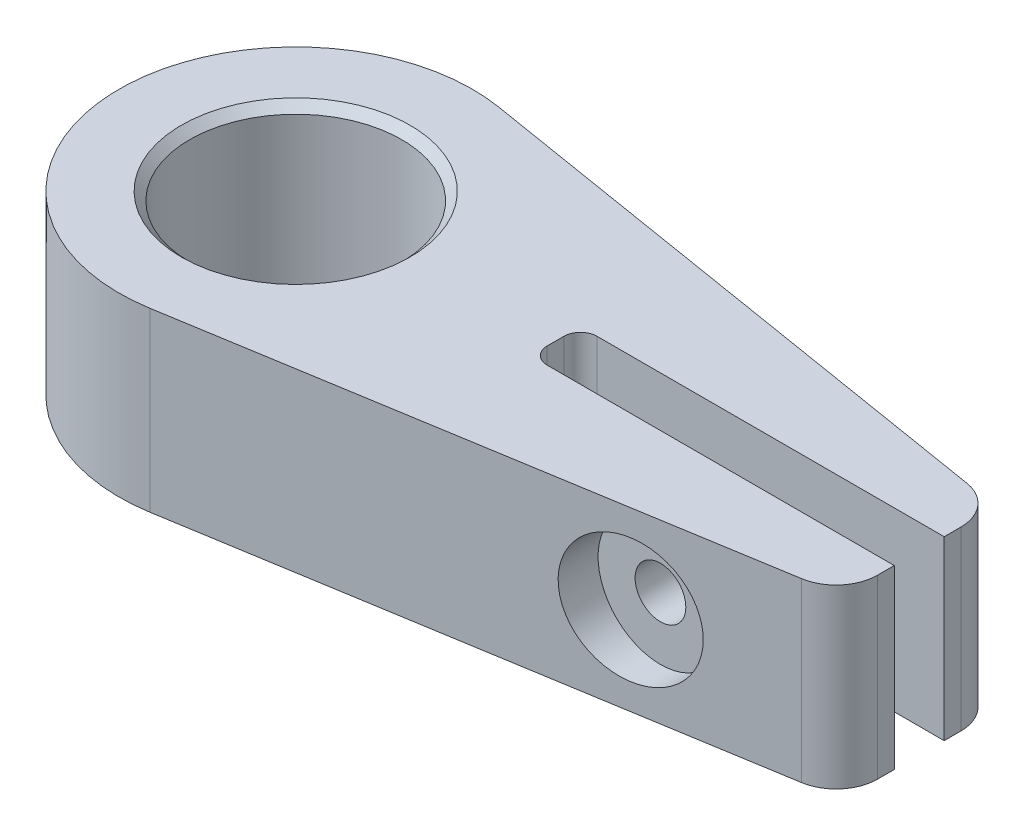
ISO-10303-21;
HEADER;
FILE_DESCRIPTION(('STEP AP214'),'2;1');
FILE_NAME('part.step','',(''),(''),'','','');
FILE_SCHEMA(('AUTOMOTIVE_DESIGN { 1 0 10303 214 1 1 1 1 }'));
ENDSEC;
DATA;
#1=APPLICATION_CONTEXT('core data for automotive mechanical design processes');
#2=APPLICATION_PROTOCOL_DEFINITION('international standard','automotive_design',2000,#1);
#3=PRODUCT_CONTEXT('',#1,'mechanical');
#4=PRODUCT('Part','Part','',(#3));
#5=PRODUCT_RELATED_PRODUCT_CATEGORY('part','',(#4));
#6=PRODUCT_DEFINITION_FORMATION('','',#4);
#7=PRODUCT_DEFINITION_CONTEXT('part definition',#1,'design');
#8=PRODUCT_DEFINITION('design','',#6,#7);
#9=PRODUCT_DEFINITION_SHAPE('','',#8);
#10=(LENGTH_UNIT() NAMED_UNIT(*) SI_UNIT(.MILLI.,.METRE.));
#11=(NAMED_UNIT(*) PLANE_ANGLE_UNIT() SI_UNIT($,.RADIAN.));
#12=(NAMED_UNIT(*) SI_UNIT($,.STERADIAN.) SOLID_ANGLE_UNIT());
#13=UNCERTAINTY_MEASURE_WITH_UNIT(LENGTH_MEASURE(1.E-05),#10,'distance_accuracy_value','');
#14=(GEOMETRIC_REPRESENTATION_CONTEXT(3) GLOBAL_UNCERTAINTY_ASSIGNED_CONTEXT((#13)) GLOBAL_UNIT_ASSIGNED_CONTEXT((#10,
#11,#12)) REPRESENTATION_CONTEXT('',''));
#15=CARTESIAN_POINT('',(0.,0.,0.));
#16=DIRECTION('',(0.,0.,1.));
#17=DIRECTION('',(1.,0.,0.));
#18=AXIS2_PLACEMENT_3D('',#15,#16,#17);
#19=CARTESIAN_POINT('',(1.74441855820216,10.795,-10.6531229643612));
#20=DIRECTION('',(-0.161595049393438,0.,0.986857152789365));
#21=DIRECTION('',(0.986857152789365,0.,0.161595049393438));
#22=AXIS2_PLACEMENT_3D('',#19,#20,#21);
#23=PLANE('',#22);
#24=DIRECTION('',(-0.986857152789365,0.,-0.161595049393438));
#25=VECTOR('',#24,1.);
#26=CARTESIAN_POINT('',(1.74441855820216,10.795,-10.6531229643612));
#27=LINE('',#26,#25);
#28=CARTESIAN_POINT('',(35.9704514254593,10.795,-5.04870751670183));
#29=VERTEX_POINT('',#28);
#30=CARTESIAN_POINT('',(1.74441855820216,10.795,-10.6531229643612));
#31=VERTEX_POINT('',#30);
#32=EDGE_CURVE('E222',#29,#31,#27,.T.);
#33=ORIENTED_EDGE('',*,*,#32,.F.);
#34=DIRECTION('',(0.,-1.,0.));
#35=VECTOR('',#34,1.);
#36=CARTESIAN_POINT('',(35.9704514254593,10.795,-5.04870751670183));
#37=LINE('',#36,#35);
#38=CARTESIAN_POINT('',(35.9704514254593,0.,-5.04870751670183));
#39=VERTEX_POINT('',#38);
#40=EDGE_CURVE('E286',#29,#39,#37,.T.);
#41=ORIENTED_EDGE('',*,*,#40,.T.);
#42=DIRECTION('',(-0.986857152789365,0.,-0.161595049393438));
#43=VECTOR('',#42,1.);
#44=CARTESIAN_POINT('',(1.74441855820216,0.,-10.6531229643612));
#45=LINE('',#44,#43);
#46=CARTESIAN_POINT('',(1.74441855820216,0.,-10.6531229643612));
#47=VERTEX_POINT('',#46);
#48=EDGE_CURVE('E204',#39,#47,#45,.T.);
#49=ORIENTED_EDGE('',*,*,#48,.T.);
#50=DIRECTION('',(0.,-1.,0.));
#51=VECTOR('',#50,1.);
#52=CARTESIAN_POINT('',(1.74441855820216,10.795,-10.6531229643612));
#53=LINE('',#52,#51);
#54=EDGE_CURVE('E217',#31,#47,#53,.T.);
#55=ORIENTED_EDGE('',*,*,#54,.F.);
#56=EDGE_LOOP('',(#33,#41,#49,#55));
#57=FACE_BOUND('',#56,.T.);
#58=DIRECTION('',(-0.857446756121753,0.495047115462666,-0.140404465343438));
#59=VECTOR('',#58,1.);
#60=CARTESIAN_POINT('',(4.23908548831598,15.2317464535393,-10.2446283563498));
#61=LINE('',#60,#59);
#62=CARTESIAN_POINT('',(26.9875,2.09794321158129,-6.51964024003772));
#63=VERTEX_POINT('',#62);
#64=CARTESIAN_POINT('',(24.13,3.74772160579065,-6.98754773033313));
#65=VERTEX_POINT('',#64);
#66=EDGE_CURVE('E257',#63,#65,#61,.T.);
#67=ORIENTED_EDGE('',*,*,#66,.F.);
#68=DIRECTION('',(-0.857446756121753,-0.495047115462666,-0.140404465343438));
#69=VECTOR('',#68,1.);
#70=CARTESIAN_POINT('',(11.6224786928472,-6.77305597620772,-9.03561873808336));
#71=LINE('',#70,#69);
#72=CARTESIAN_POINT('',(29.845,3.74772160579065,-6.0517327497423));
#73=VERTEX_POINT('',#72);
#74=EDGE_CURVE('E226',#73,#63,#71,.T.);
#75=ORIENTED_EDGE('',*,*,#74,.F.);
#76=DIRECTION('',(0.,-1.,0.));
#77=VECTOR('',#76,1.);
#78=CARTESIAN_POINT('',(29.845,10.795,-6.0517327497423));
#79=LINE('',#78,#77);
#80=CARTESIAN_POINT('',(29.845,7.04727839420936,-6.0517327497423));
#81=VERTEX_POINT('',#80);
#82=EDGE_CURVE('E244',#81,#73,#79,.T.);
#83=ORIENTED_EDGE('',*,*,#82,.F.);
#84=DIRECTION('',(0.857446756121753,-0.495047115462666,0.140404465343438));
#85=VECTOR('',#84,1.);
#86=CARTESIAN_POINT('',(7.04025440812994,20.2136044004765,-9.78594492007207));
#87=LINE('',#86,#85);
#88=CARTESIAN_POINT('',(26.9875,8.69705678841871,-6.51964024003772));
#89=VERTEX_POINT('',#88);
#90=EDGE_CURVE('E248',#89,#81,#87,.T.);
#91=ORIENTED_EDGE('',*,*,#90,.F.);
#92=DIRECTION('',(0.857446756121753,0.495047115462666,0.140404465343438));
#93=VECTOR('',#92,1.);
#94=CARTESIAN_POINT('',(8.82130977303323,-1.79119802927051,-9.49430217436111));
#95=LINE('',#94,#93);
#96=CARTESIAN_POINT('',(24.13,7.04727839420935,-6.98754773033313));
#97=VERTEX_POINT('',#96);
#98=EDGE_CURVE('E251',#97,#89,#95,.T.);
#99=ORIENTED_EDGE('',*,*,#98,.F.);
#100=DIRECTION('',(0.,1.,0.));
#101=VECTOR('',#100,1.);
#102=CARTESIAN_POINT('',(24.13,10.795,-6.98754773033313));
#103=LINE('',#102,#101);
#104=EDGE_CURVE('E254',#65,#97,#103,.T.);
#105=ORIENTED_EDGE('',*,*,#104,.F.);
#106=EDGE_LOOP('',(#67,#75,#83,#91,#99,#105));
#107=FACE_BOUND('',#106,.T.);
#108=ADVANCED_FACE('F47',(#57,#107),#23,.F.);
#109=CARTESIAN_POINT('',(26.9875,5.3975,-10.795));
#110=DIRECTION('',(0.,0.,1.));
#111=DIRECTION('',(1.,0.,0.));
#112=AXIS2_PLACEMENT_3D('',#109,#110,#111);
#113=CYLINDRICAL_SURFACE('',#112,1.55);
#114=CARTESIAN_POINT('',(26.9875,5.3975,-1.525));
#115=DIRECTION('',(0.,0.,-1.));
#116=DIRECTION('',(-1.,0.,0.));
#117=AXIS2_PLACEMENT_3D('',#114,#115,#116);
#118=CIRCLE('',#117,1.55);
#119=CARTESIAN_POINT('',(28.5375,5.3975,-1.525));
#120=VERTEX_POINT('',#119);
#121=EDGE_CURVE('E236',#120,#120,#118,.T.);
#122=CARTESIAN_POINT('',(26.9875,5.3975,-4.7));
#123=DIRECTION('',(0.,0.,-1.));
#124=DIRECTION('',(-1.,0.,0.));
#125=AXIS2_PLACEMENT_3D('',#122,#123,#124);
#126=CIRCLE('',#125,1.55);
#127=CARTESIAN_POINT('',(28.5375,5.3975,-4.7));
#128=VERTEX_POINT('',#127);
#129=EDGE_CURVE('E237',#128,#128,#126,.F.);
#130=CARTESIAN_POINT('',(28.5375,5.3975,-1.525));
#131=CARTESIAN_POINT('',(28.5375,5.3975,-1.55807291666667));
#132=CARTESIAN_POINT('',(28.5375,5.3975,-1.59114583333333));
#133=CARTESIAN_POINT('',(28.5375,5.3975,-1.65729166666667));
#134=CARTESIAN_POINT('',(28.5375,5.3975,-1.69036458333333));
#135=CARTESIAN_POINT('',(28.5375,5.3975,-1.75651041666667));
#136=CARTESIAN_POINT('',(28.5375,5.3975,-1.78958333333333));
#137=CARTESIAN_POINT('',(28.5375,5.3975,-1.85572916666667));
#138=CARTESIAN_POINT('',(28.5375,5.3975,-1.88880208333333));
#139=CARTESIAN_POINT('',(28.5375,5.3975,-1.95494791666666));
#140=CARTESIAN_POINT('',(28.5375,5.3975,-1.98802083333333));
#141=CARTESIAN_POINT('',(28.5375,5.3975,-2.05416666666666));
#142=CARTESIAN_POINT('',(28.5375,5.3975,-2.08723958333333));
#143=CARTESIAN_POINT('',(28.5375,5.3975,-2.15338541666667));
#144=CARTESIAN_POINT('',(28.5375,5.3975,-2.18645833333333));
#145=CARTESIAN_POINT('',(28.5375,5.3975,-2.25260416666666));
#146=CARTESIAN_POINT('',(28.5375,5.3975,-2.28567708333333));
#147=CARTESIAN_POINT('',(28.5375,5.3975,-2.35182291666666));
#148=CARTESIAN_POINT('',(28.5375,5.3975,-2.38489583333333));
#149=CARTESIAN_POINT('',(28.5375,5.3975,-2.45104166666667));
#150=CARTESIAN_POINT('',(28.5375,5.3975,-2.48411458333333));
#151=CARTESIAN_POINT('',(28.5375,5.3975,-2.55026041666666));
#152=CARTESIAN_POINT('',(28.5375,5.3975,-2.58333333333333));
#153=CARTESIAN_POINT('',(28.5375,5.3975,-2.64947916666666));
#154=CARTESIAN_POINT('',(28.5375,5.3975,-2.68255208333333));
#155=CARTESIAN_POINT('',(28.5375,5.3975,-2.74869791666666));
#156=CARTESIAN_POINT('',(28.5375,5.3975,-2.78177083333333));
#157=CARTESIAN_POINT('',(28.5375,5.3975,-2.84791666666667));
#158=CARTESIAN_POINT('',(28.5375,5.3975,-2.88098958333333));
#159=CARTESIAN_POINT('',(28.5375,5.3975,-2.94713541666666));
#160=CARTESIAN_POINT('',(28.5375,5.3975,-2.98020833333333));
#161=CARTESIAN_POINT('',(28.5375,5.3975,-3.04635416666666));
#162=CARTESIAN_POINT('',(28.5375,5.3975,-3.07942708333333));
#163=CARTESIAN_POINT('',(28.5375,5.3975,-3.14557291666666));
#164=CARTESIAN_POINT('',(28.5375,5.3975,-3.17864583333333));
#165=CARTESIAN_POINT('',(28.5375,5.3975,-3.24479166666666));
#166=CARTESIAN_POINT('',(28.5375,5.3975,-3.27786458333333));
#167=CARTESIAN_POINT('',(28.5375,5.3975,-3.34401041666666));
#168=CARTESIAN_POINT('',(28.5375,5.3975,-3.37708333333333));
#169=CARTESIAN_POINT('',(28.5375,5.3975,-3.44322916666666));
#170=CARTESIAN_POINT('',(28.5375,5.3975,-3.47630208333333));
#171=CARTESIAN_POINT('',(28.5375,5.3975,-3.54244791666666));
#172=CARTESIAN_POINT('',(28.5375,5.3975,-3.57552083333333));
#173=CARTESIAN_POINT('',(28.5375,5.3975,-3.64166666666666));
#174=CARTESIAN_POINT('',(28.5375,5.3975,-3.67473958333333));
#175=CARTESIAN_POINT('',(28.5375,5.3975,-3.74088541666666));
#176=CARTESIAN_POINT('',(28.5375,5.3975,-3.77395833333333));
#177=CARTESIAN_POINT('',(28.5375,5.3975,-3.84010416666666));
#178=CARTESIAN_POINT('',(28.5375,5.3975,-3.87317708333333));
#179=CARTESIAN_POINT('',(28.5375,5.3975,-3.93932291666666));
#180=CARTESIAN_POINT('',(28.5375,5.3975,-3.97239583333333));
#181=CARTESIAN_POINT('',(28.5375,5.3975,-4.03854166666666));
#182=CARTESIAN_POINT('',(28.5375,5.3975,-4.07161458333333));
#183=CARTESIAN_POINT('',(28.5375,5.3975,-4.13776041666666));
#184=CARTESIAN_POINT('',(28.5375,5.3975,-4.17083333333333));
#185=CARTESIAN_POINT('',(28.5375,5.3975,-4.23697916666666));
#186=CARTESIAN_POINT('',(28.5375,5.3975,-4.27005208333333));
#187=CARTESIAN_POINT('',(28.5375,5.3975,-4.33619791666666));
#188=CARTESIAN_POINT('',(28.5375,5.3975,-4.36927083333333));
#189=CARTESIAN_POINT('',(28.5375,5.3975,-4.43541666666666));
#190=CARTESIAN_POINT('',(28.5375,5.3975,-4.46848958333333));
#191=CARTESIAN_POINT('',(28.5375,5.3975,-4.53463541666666));
#192=CARTESIAN_POINT('',(28.5375,5.3975,-4.56770833333333));
#193=CARTESIAN_POINT('',(28.5375,5.3975,-4.63385416666666));
#194=CARTESIAN_POINT('',(28.5375,5.3975,-4.66692708333333));
#195=CARTESIAN_POINT('',(28.5375,5.3975,-4.7));
#196=B_SPLINE_CURVE_WITH_KNOTS('',3,(#130,#131,#132,#133,#134,#135,#136,#137,#138,#139,#140,
#141,#142,#143,#144,#145,#146,#147,#148,#149,#150,#151,#152,#153,#154,#155,#156,#157,#158,#159,
#160,#161,#162,#163,#164,#165,#166,#167,#168,#169,#170,#171,#172,#173,#174,#175,#176,#177,#178,
#179,#180,#181,#182,#183,#184,#185,#186,#187,#188,#189,#190,#191,#192,#193,#194,#195),
.UNSPECIFIED.,.F.,.F.,(4,2,2,2,2,2,2,2,2,2,2,2,2,2,2,2,2,2,2,2,2,2,2,2,2,2,2,2,2,2,2,2,4),(0.,
0.0992187499999995,0.198437500000001,0.29765625,0.396875,0.496093749999999,0.5953125,0.69453125,
0.793749999999999,0.892968750000001,0.9921875,1.09140625,1.190625,1.28984375,1.3890625,
1.48828125,1.5875,1.68671875,1.7859375,1.88515625,1.984375,2.08359375,2.1828125,2.28203125,
2.38125,2.48046875,2.5796875,2.67890625,2.778125,2.87734375,2.9765625,3.07578125,3.175),.UNSPECIFIED.);
#197=EDGE_CURVE('BSEAM354',#120,#128,#196,.T.);
#198=ORIENTED_EDGE('',*,*,#121,.F.);
#199=ORIENTED_EDGE('',*,*,#129,.F.);
#200=ORIENTED_EDGE('',*,*,#197,.T.);
#201=ORIENTED_EDGE('',*,*,#197,.F.);
#202=EDGE_LOOP('',(#198,#200,#199,#201));
#203=FACE_BOUND('',#202,.T.);
#204=ADVANCED_FACE('F354',(#203),#113,.F.);
#205=CARTESIAN_POINT('',(26.9875,5.3975,1.525));
#206=DIRECTION('',(0.,0.,1.));
#207=DIRECTION('',(1.,0.,0.));
#208=AXIS2_PLACEMENT_3D('',#205,#206,#207);
#209=CIRCLE('',#208,1.55);
#210=CARTESIAN_POINT('',(28.5375,5.3975,1.525));
#211=VERTEX_POINT('',#210);
#212=EDGE_CURVE('E458',#211,#211,#209,.T.);
#213=CARTESIAN_POINT('',(26.9875,5.3975,4.7));
#214=DIRECTION('',(0.,0.,1.));
#215=DIRECTION('',(1.,0.,0.));
#216=AXIS2_PLACEMENT_3D('',#213,#214,#215);
#217=CIRCLE('',#216,1.55);
#218=CARTESIAN_POINT('',(28.5375,5.3975,4.7));
#219=VERTEX_POINT('',#218);
#220=EDGE_CURVE('E227',#219,#219,#217,.F.);
#221=CARTESIAN_POINT('',(28.5375,5.3975,1.525));
#222=CARTESIAN_POINT('',(28.5375,5.3975,1.55807291666667));
#223=CARTESIAN_POINT('',(28.5375,5.3975,1.59114583333333));
#224=CARTESIAN_POINT('',(28.5375,5.3975,1.65729166666666));
#225=CARTESIAN_POINT('',(28.5375,5.3975,1.69036458333333));
#226=CARTESIAN_POINT('',(28.5375,5.3975,1.75651041666666));
#227=CARTESIAN_POINT('',(28.5375,5.3975,1.78958333333333));
#228=CARTESIAN_POINT('',(28.5375,5.3975,1.85572916666667));
#229=CARTESIAN_POINT('',(28.5375,5.3975,1.88880208333333));
#230=CARTESIAN_POINT('',(28.5375,5.3975,1.95494791666666));
#231=CARTESIAN_POINT('',(28.5375,5.3975,1.98802083333333));
#232=CARTESIAN_POINT('',(28.5375,5.3975,2.05416666666666));
#233=CARTESIAN_POINT('',(28.5375,5.3975,2.08723958333333));
#234=CARTESIAN_POINT('',(28.5375,5.3975,2.15338541666667));
#235=CARTESIAN_POINT('',(28.5375,5.3975,2.18645833333333));
#236=CARTESIAN_POINT('',(28.5375,5.3975,2.25260416666666));
#237=CARTESIAN_POINT('',(28.5375,5.3975,2.28567708333333));
#238=CARTESIAN_POINT('',(28.5375,5.3975,2.35182291666666));
#239=CARTESIAN_POINT('',(28.5375,5.3975,2.38489583333333));
#240=CARTESIAN_POINT('',(28.5375,5.3975,2.45104166666666));
#241=CARTESIAN_POINT('',(28.5375,5.3975,2.48411458333333));
#242=CARTESIAN_POINT('',(28.5375,5.3975,2.55026041666666));
#243=CARTESIAN_POINT('',(28.5375,5.3975,2.58333333333333));
#244=CARTESIAN_POINT('',(28.5375,5.3975,2.64947916666666));
#245=CARTESIAN_POINT('',(28.5375,5.3975,2.68255208333333));
#246=CARTESIAN_POINT('',(28.5375,5.3975,2.74869791666666));
#247=CARTESIAN_POINT('',(28.5375,5.3975,2.78177083333333));
#248=CARTESIAN_POINT('',(28.5375,5.3975,2.84791666666666));
#249=CARTESIAN_POINT('',(28.5375,5.3975,2.88098958333333));
#250=CARTESIAN_POINT('',(28.5375,5.3975,2.94713541666666));
#251=CARTESIAN_POINT('',(28.5375,5.3975,2.98020833333333));
#252=CARTESIAN_POINT('',(28.5375,5.3975,3.04635416666666));
#253=CARTESIAN_POINT('',(28.5375,5.3975,3.07942708333333));
#254=CARTESIAN_POINT('',(28.5375,5.3975,3.14557291666666));
#255=CARTESIAN_POINT('',(28.5375,5.3975,3.17864583333333));
#256=CARTESIAN_POINT('',(28.5375,5.3975,3.24479166666666));
#257=CARTESIAN_POINT('',(28.5375,5.3975,3.27786458333333));
#258=CARTESIAN_POINT('',(28.5375,5.3975,3.34401041666666));
#259=CARTESIAN_POINT('',(28.5375,5.3975,3.37708333333333));
#260=CARTESIAN_POINT('',(28.5375,5.3975,3.44322916666666));
#261=CARTESIAN_POINT('',(28.5375,5.3975,3.47630208333333));
#262=CARTESIAN_POINT('',(28.5375,5.3975,3.54244791666666));
#263=CARTESIAN_POINT('',(28.5375,5.3975,3.57552083333333));
#264=CARTESIAN_POINT('',(28.5375,5.3975,3.64166666666666));
#265=CARTESIAN_POINT('',(28.5375,5.3975,3.67473958333333));
#266=CARTESIAN_POINT('',(28.5375,5.3975,3.74088541666666));
#267=CARTESIAN_POINT('',(28.5375,5.3975,3.77395833333333));
#268=CARTESIAN_POINT('',(28.5375,5.3975,3.84010416666666));
#269=CARTESIAN_POINT('',(28.5375,5.3975,3.87317708333333));
#270=CARTESIAN_POINT('',(28.5375,5.3975,3.93932291666666));
#271=CARTESIAN_POINT('',(28.5375,5.3975,3.97239583333333));
#272=CARTESIAN_POINT('',(28.5375,5.3975,4.03854166666666));
#273=CARTESIAN_POINT('',(28.5375,5.3975,4.07161458333333));
#274=CARTESIAN_POINT('',(28.5375,5.3975,4.13776041666666));
#275=CARTESIAN_POINT('',(28.5375,5.3975,4.17083333333333));
#276=CARTESIAN_POINT('',(28.5375,5.3975,4.23697916666666));
#277=CARTESIAN_POINT('',(28.5375,5.3975,4.27005208333333));
#278=CARTESIAN_POINT('',(28.5375,5.3975,4.33619791666666));
#279=CARTESIAN_POINT('',(28.5375,5.3975,4.36927083333333));
#280=CARTESIAN_POINT('',(28.5375,5.3975,4.43541666666666));
#281=CARTESIAN_POINT('',(28.5375,5.3975,4.46848958333333));
#282=CARTESIAN_POINT('',(28.5375,5.3975,4.53463541666666));
#283=CARTESIAN_POINT('',(28.5375,5.3975,4.56770833333333));
#284=CARTESIAN_POINT('',(28.5375,5.3975,4.63385416666666));
#285=CARTESIAN_POINT('',(28.5375,5.3975,4.66692708333333));
#286=CARTESIAN_POINT('',(28.5375,5.3975,4.7));
#287=B_SPLINE_CURVE_WITH_KNOTS('',3,(#221,#222,#223,#224,#225,#226,#227,#228,#229,#230,#231,
#232,#233,#234,#235,#236,#237,#238,#239,#240,#241,#242,#243,#244,#245,#246,#247,#248,#249,#250,
#251,#252,#253,#254,#255,#256,#257,#258,#259,#260,#261,#262,#263,#264,#265,#266,#267,#268,#269,
#270,#271,#272,#273,#274,#275,#276,#277,#278,#279,#280,#281,#282,#283,#284,#285,#286),
.UNSPECIFIED.,.F.,.F.,(4,2,2,2,2,2,2,2,2,2,2,2,2,2,2,2,2,2,2,2,2,2,2,2,2,2,2,2,2,2,2,2,4),(0.,
0.0992187499999995,0.198437499999999,0.29765625,0.396875,0.496093749999999,0.5953125,0.69453125,
0.793749999999999,0.892968749999999,0.992187499999998,1.09140625,1.190625,1.28984375,1.3890625,
1.48828125,1.5875,1.68671875,1.7859375,1.88515625,1.984375,2.08359375,2.1828125,2.28203125,
2.38125,2.48046875,2.5796875,2.67890625,2.778125,2.87734375,2.9765625,3.07578125,3.175),.UNSPECIFIED.);
#288=EDGE_CURVE('BSEAM350',#211,#219,#287,.T.);
#289=ORIENTED_EDGE('',*,*,#212,.F.);
#290=ORIENTED_EDGE('',*,*,#220,.F.);
#291=ORIENTED_EDGE('',*,*,#288,.T.);
#292=ORIENTED_EDGE('',*,*,#288,.F.);
#293=EDGE_LOOP('',(#289,#291,#290,#292));
#294=FACE_BOUND('',#293,.T.);
#295=ADVANCED_FACE('F350',(#294),#113,.F.);
#296=CARTESIAN_POINT('',(0.,10.795,0.));
#297=DIRECTION('',(0.,1.,0.));
#298=DIRECTION('',(0.,0.,1.));
#299=AXIS2_PLACEMENT_3D('',#296,#297,#298);
#300=PLANE('',#299);
#301=CARTESIAN_POINT('',(0.,10.795,0.));
#302=DIRECTION('',(0.,1.,0.));
#303=DIRECTION('',(0.,0.,1.));
#304=AXIS2_PLACEMENT_3D('',#301,#302,#303);
#305=CIRCLE('',#304,6.985);
#306=CARTESIAN_POINT('',(0.,10.795,6.985));
#307=VERTEX_POINT('',#306);
#308=EDGE_CURVE('E57',#307,#307,#305,.F.);
#309=ORIENTED_EDGE('',*,*,#308,.T.);
#310=EDGE_LOOP('',(#309));
#311=FACE_BOUND('',#310,.T.);
#312=DIRECTION('',(0.,0.,-1.));
#313=VECTOR('',#312,1.);
#314=CARTESIAN_POINT('',(38.1,10.795,4.69999999999999));
#315=LINE('',#314,#313);
#316=CARTESIAN_POINT('',(38.1,10.795,-1.525));
#317=VERTEX_POINT('',#316);
#318=CARTESIAN_POINT('',(38.1,10.795,-2.54209034861685));
#319=VERTEX_POINT('',#318);
#320=EDGE_CURVE('E181',#317,#319,#315,.T.);
#321=ORIENTED_EDGE('',*,*,#320,.T.);
#322=CARTESIAN_POINT('',(35.56,10.795,-2.54209034861685));
#323=DIRECTION('',(0.,1.,0.));
#324=DIRECTION('',(0.,0.,1.));
#325=AXIS2_PLACEMENT_3D('',#322,#323,#324);
#326=CIRCLE('',#325,2.54);
#327=EDGE_CURVE('E300',#319,#29,#326,.T.);
#328=ORIENTED_EDGE('',*,*,#327,.T.);
#329=ORIENTED_EDGE('',*,*,#32,.T.);
#330=CARTESIAN_POINT('',(0.,10.795,0.));
#331=DIRECTION('',(0.,1.,0.));
#332=DIRECTION('',(0.,0.,1.));
#333=AXIS2_PLACEMENT_3D('',#330,#331,#332);
#334=CIRCLE('',#333,10.795);
#335=CARTESIAN_POINT('',(1.74441855820216,10.795,10.6531229643612));
#336=VERTEX_POINT('',#335);
#337=EDGE_CURVE('E209',#31,#336,#334,.T.);
#338=ORIENTED_EDGE('',*,*,#337,.T.);
#339=DIRECTION('',(0.986857152789365,0.,-0.161595049393438));
#340=VECTOR('',#339,1.);
#341=CARTESIAN_POINT('',(1.74441855820216,10.795,10.6531229643612));
#342=LINE('',#341,#340);
#343=CARTESIAN_POINT('',(35.9704514254593,10.795,5.04870751670183));
#344=VERTEX_POINT('',#343);
#345=EDGE_CURVE('E466',#336,#344,#342,.T.);
#346=ORIENTED_EDGE('',*,*,#345,.T.);
#347=CARTESIAN_POINT('',(35.56,10.795,2.54209034861685));
#348=DIRECTION('',(0.,1.,0.));
#349=DIRECTION('',(0.,0.,1.));
#350=AXIS2_PLACEMENT_3D('',#347,#348,#349);
#351=CIRCLE('',#350,2.54);
#352=CARTESIAN_POINT('',(38.1,10.795,2.54209034861685));
#353=VERTEX_POINT('',#352);
#354=EDGE_CURVE('E64',#344,#353,#351,.T.);
#355=ORIENTED_EDGE('',*,*,#354,.T.);
#356=CARTESIAN_POINT('',(38.1,10.795,1.525));
#357=VERTEX_POINT('',#356);
#358=EDGE_CURVE('E188',#353,#357,#315,.T.);
#359=ORIENTED_EDGE('',*,*,#358,.T.);
#360=DIRECTION('',(-1.,0.,0.));
#361=VECTOR('',#360,1.);
#362=CARTESIAN_POINT('',(60.325,10.795,1.525));
#363=LINE('',#362,#361);
#364=CARTESIAN_POINT('',(16.891,10.795,1.52499999999999));
#365=VERTEX_POINT('',#364);
#366=EDGE_CURVE('E469',#357,#365,#363,.T.);
#367=ORIENTED_EDGE('',*,*,#366,.T.);
#368=CARTESIAN_POINT('',(16.891,10.795,0.508999999999994));
#369=DIRECTION('',(0.,1.,0.));
#370=DIRECTION('',(0.,0.,1.));
#371=AXIS2_PLACEMENT_3D('',#368,#369,#370);
#372=CIRCLE('',#371,1.016);
#373=CARTESIAN_POINT('',(15.875,10.795,0.508999999999994));
#374=VERTEX_POINT('',#373);
#375=EDGE_CURVE('E283',#365,#374,#372,.F.);
#376=ORIENTED_EDGE('',*,*,#375,.T.);
#377=DIRECTION('',(0.,0.,-1.));
#378=VECTOR('',#377,1.);
#379=CARTESIAN_POINT('',(15.875,10.795,-1.52499999999999));
#380=LINE('',#379,#378);
#381=CARTESIAN_POINT('',(15.875,10.795,-0.508999999999994));
#382=VERTEX_POINT('',#381);
#383=EDGE_CURVE('E472',#374,#382,#380,.T.);
#384=ORIENTED_EDGE('',*,*,#383,.T.);
#385=CARTESIAN_POINT('',(16.891,10.795,-0.508999999999995));
#386=DIRECTION('',(0.,1.,0.));
#387=DIRECTION('',(0.,0.,1.));
#388=AXIS2_PLACEMENT_3D('',#385,#386,#387);
#389=CIRCLE('',#388,1.016);
#390=CARTESIAN_POINT('',(16.891,10.795,-1.52499999999999));
#391=VERTEX_POINT('',#390);
#392=EDGE_CURVE('E276',#382,#391,#389,.F.);
#393=ORIENTED_EDGE('',*,*,#392,.T.);
#394=DIRECTION('',(1.,0.,0.));
#395=VECTOR('',#394,1.);
#396=CARTESIAN_POINT('',(60.325,10.795,-1.525));
#397=LINE('',#396,#395);
#398=EDGE_CURVE('E476',#391,#317,#397,.T.);
#399=ORIENTED_EDGE('',*,*,#398,.T.);
#400=EDGE_LOOP('',(#321,#328,#329,#338,#346,#355,#359,#367,#376,#384,#393,#399));
#401=FACE_BOUND('',#400,.T.);
#402=ADVANCED_FACE('F321',(#311,#401),#300,.T.);
#403=CARTESIAN_POINT('',(0.,0.,0.));
#404=DIRECTION('',(0.,1.,0.));
#405=DIRECTION('',(0.,0.,1.));
#406=AXIS2_PLACEMENT_3D('',#403,#404,#405);
#407=PLANE('',#406);
#408=CARTESIAN_POINT('',(0.,0.,0.));
#409=DIRECTION('',(0.,1.,0.));
#410=DIRECTION('',(0.,0.,1.));
#411=AXIS2_PLACEMENT_3D('',#408,#409,#410);
#412=CIRCLE('',#411,6.98499999999999);
#413=CARTESIAN_POINT('',(0.,0.,6.98499999999999));
#414=VERTEX_POINT('',#413);
#415=EDGE_CURVE('E11',#414,#414,#412,.T.);
#416=ORIENTED_EDGE('',*,*,#415,.T.);
#417=EDGE_LOOP('',(#416));
#418=FACE_BOUND('',#417,.T.);
#419=ORIENTED_EDGE('',*,*,#48,.F.);
#420=CARTESIAN_POINT('',(35.56,0.,-2.54209034861685));
#421=DIRECTION('',(0.,1.,0.));
#422=DIRECTION('',(0.,0.,1.));
#423=AXIS2_PLACEMENT_3D('',#420,#421,#422);
#424=CIRCLE('',#423,2.54);
#425=CARTESIAN_POINT('',(38.1,0.,-2.54209034861685));
#426=VERTEX_POINT('',#425);
#427=EDGE_CURVE('E195',#39,#426,#424,.F.);
#428=ORIENTED_EDGE('',*,*,#427,.T.);
#429=DIRECTION('',(0.,0.,-1.));
#430=VECTOR('',#429,1.);
#431=CARTESIAN_POINT('',(38.1,0.,4.69999999999999));
#432=LINE('',#431,#430);
#433=CARTESIAN_POINT('',(38.1,0.,-1.525));
#434=VERTEX_POINT('',#433);
#435=EDGE_CURVE('E178',#434,#426,#432,.T.);
#436=ORIENTED_EDGE('',*,*,#435,.F.);
#437=DIRECTION('',(1.,0.,0.));
#438=VECTOR('',#437,1.);
#439=CARTESIAN_POINT('',(60.325,0.,-1.525));
#440=LINE('',#439,#438);
#441=CARTESIAN_POINT('',(16.891,0.,-1.52499999999999));
#442=VERTEX_POINT('',#441);
#443=EDGE_CURVE('E194',#442,#434,#440,.T.);
#444=ORIENTED_EDGE('',*,*,#443,.F.);
#445=CARTESIAN_POINT('',(16.891,0.,-0.508999999999995));
#446=DIRECTION('',(0.,1.,0.));
#447=DIRECTION('',(0.,0.,1.));
#448=AXIS2_PLACEMENT_3D('',#445,#446,#447);
#449=CIRCLE('',#448,1.016);
#450=CARTESIAN_POINT('',(15.875,0.,-0.508999999999994));
#451=VERTEX_POINT('',#450);
#452=EDGE_CURVE('E273',#442,#451,#449,.T.);
#453=ORIENTED_EDGE('',*,*,#452,.T.);
#454=DIRECTION('',(0.,0.,-1.));
#455=VECTOR('',#454,1.);
#456=CARTESIAN_POINT('',(15.875,0.,-1.52499999999999));
#457=LINE('',#456,#455);
#458=CARTESIAN_POINT('',(15.875,0.,0.508999999999994));
#459=VERTEX_POINT('',#458);
#460=EDGE_CURVE('E205',#459,#451,#457,.T.);
#461=ORIENTED_EDGE('',*,*,#460,.F.);
#462=CARTESIAN_POINT('',(16.891,0.,0.508999999999994));
#463=DIRECTION('',(0.,1.,0.));
#464=DIRECTION('',(0.,0.,1.));
#465=AXIS2_PLACEMENT_3D('',#462,#463,#464);
#466=CIRCLE('',#465,1.016);
#467=CARTESIAN_POINT('',(16.891,0.,1.52499999999999));
#468=VERTEX_POINT('',#467);
#469=EDGE_CURVE('E279',#459,#468,#466,.T.);
#470=ORIENTED_EDGE('',*,*,#469,.T.);
#471=DIRECTION('',(-1.,0.,0.));
#472=VECTOR('',#471,1.);
#473=CARTESIAN_POINT('',(60.325,0.,1.525));
#474=LINE('',#473,#472);
#475=CARTESIAN_POINT('',(38.1,0.,1.525));
#476=VERTEX_POINT('',#475);
#477=EDGE_CURVE('E213',#476,#468,#474,.T.);
#478=ORIENTED_EDGE('',*,*,#477,.F.);
#479=CARTESIAN_POINT('',(38.1,0.,2.54209034861685));
#480=VERTEX_POINT('',#479);
#481=EDGE_CURVE('E197',#480,#476,#432,.T.);
#482=ORIENTED_EDGE('',*,*,#481,.F.);
#483=CARTESIAN_POINT('',(35.56,0.,2.54209034861685));
#484=DIRECTION('',(0.,1.,0.));
#485=DIRECTION('',(0.,0.,1.));
#486=AXIS2_PLACEMENT_3D('',#483,#484,#485);
#487=CIRCLE('',#486,2.54);
#488=CARTESIAN_POINT('',(35.9704514254593,0.,5.04870751670183));
#489=VERTEX_POINT('',#488);
#490=EDGE_CURVE('E290',#480,#489,#487,.F.);
#491=ORIENTED_EDGE('',*,*,#490,.T.);
#492=DIRECTION('',(0.986857152789365,0.,-0.161595049393438));
#493=VECTOR('',#492,1.);
#494=CARTESIAN_POINT('',(1.74441855820216,0.,10.6531229643612));
#495=LINE('',#494,#493);
#496=CARTESIAN_POINT('',(1.74441855820216,0.,10.6531229643612));
#497=VERTEX_POINT('',#496);
#498=EDGE_CURVE('E484',#497,#489,#495,.T.);
#499=ORIENTED_EDGE('',*,*,#498,.F.);
#500=CARTESIAN_POINT('',(0.,0.,0.));
#501=DIRECTION('',(0.,1.,0.));
#502=DIRECTION('',(0.,0.,1.));
#503=AXIS2_PLACEMENT_3D('',#500,#501,#502);
#504=CIRCLE('',#503,10.795);
#505=EDGE_CURVE('E462',#47,#497,#504,.T.);
#506=ORIENTED_EDGE('',*,*,#505,.F.);
#507=EDGE_LOOP('',(#419,#428,#436,#444,#453,#461,#470,#478,#482,#491,#499,#506));
#508=FACE_BOUND('',#507,.T.);
#509=ADVANCED_FACE('F193',(#418,#508),#407,.F.);
#510=CARTESIAN_POINT('',(0.,10.795,0.));
#511=DIRECTION('',(0.,-1.,0.));
#512=DIRECTION('',(0.,0.,-1.));
#513=AXIS2_PLACEMENT_3D('',#510,#511,#512);
#514=CYLINDRICAL_SURFACE('',#513,10.795);
#515=ORIENTED_EDGE('',*,*,#505,.T.);
#516=DIRECTION('',(0.,-1.,0.));
#517=VECTOR('',#516,1.);
#518=CARTESIAN_POINT('',(1.74441855820216,10.795,10.6531229643612));
#519=LINE('',#518,#517);
#520=EDGE_CURVE('E221',#336,#497,#519,.T.);
#521=ORIENTED_EDGE('',*,*,#520,.F.);
#522=ORIENTED_EDGE('',*,*,#337,.F.);
#523=ORIENTED_EDGE('',*,*,#54,.T.);
#524=EDGE_LOOP('',(#515,#521,#522,#523));
#525=FACE_BOUND('',#524,.T.);
#526=ADVANCED_FACE('F341',(#525),#514,.T.);
#527=CARTESIAN_POINT('',(1.74441855820216,10.795,10.6531229643612));
#528=DIRECTION('',(-0.161595049393438,0.,-0.986857152789365));
#529=DIRECTION('',(-0.986857152789365,0.,0.161595049393438));
#530=AXIS2_PLACEMENT_3D('',#527,#528,#529);
#531=PLANE('',#530);
#532=CARTESIAN_POINT('',(26.9875,5.3975,6.51964024003772));
#533=DIRECTION('',(-0.161595049393438,0.,-0.986857152789365));
#534=DIRECTION('',(0.986857152789365,0.,-0.161595049393438));
#535=AXIS2_PLACEMENT_3D('',#532,#533,#534);
#536=ELLIPSE('',#535,3.86074113080194,3.81);
#537=CARTESIAN_POINT('',(30.7975,5.3975,5.8957635863105));
#538=VERTEX_POINT('',#537);
#539=EDGE_CURVE('E231',#538,#538,#536,.F.);
#540=ORIENTED_EDGE('',*,*,#539,.F.);
#541=EDGE_LOOP('',(#540));
#542=FACE_BOUND('',#541,.T.);
#543=ORIENTED_EDGE('',*,*,#498,.T.);
#544=DIRECTION('',(0.,-1.,0.));
#545=VECTOR('',#544,1.);
#546=CARTESIAN_POINT('',(35.9704514254593,10.795,5.04870751670183));
#547=LINE('',#546,#545);
#548=EDGE_CURVE('E72',#489,#344,#547,.F.);
#549=ORIENTED_EDGE('',*,*,#548,.T.);
#550=ORIENTED_EDGE('',*,*,#345,.F.);
#551=ORIENTED_EDGE('',*,*,#520,.T.);
#552=EDGE_LOOP('',(#543,#549,#550,#551));
#553=FACE_BOUND('',#552,.T.);
#554=ADVANCED_FACE('F347',(#542,#553),#531,.F.);
#555=CARTESIAN_POINT('',(60.325,10.795,1.525));
#556=DIRECTION('',(0.,0.,1.));
#557=DIRECTION('',(1.,0.,0.));
#558=AXIS2_PLACEMENT_3D('',#555,#556,#557);
#559=PLANE('',#558);
#560=ORIENTED_EDGE('',*,*,#212,.T.);
#561=EDGE_LOOP('',(#560));
#562=FACE_BOUND('',#561,.T.);
#563=ORIENTED_EDGE('',*,*,#366,.F.);
#564=DIRECTION('',(0.,-1.,0.));
#565=VECTOR('',#564,1.);
#566=CARTESIAN_POINT('',(38.1,10.795,1.525));
#567=LINE('',#566,#565);
#568=EDGE_CURVE('E187',#357,#476,#567,.T.);
#569=ORIENTED_EDGE('',*,*,#568,.T.);
#570=ORIENTED_EDGE('',*,*,#477,.T.);
#571=DIRECTION('',(0.,-1.,0.));
#572=VECTOR('',#571,1.);
#573=CARTESIAN_POINT('',(16.891,10.795,1.52499999999999));
#574=LINE('',#573,#572);
#575=EDGE_CURVE('E269',#468,#365,#574,.F.);
#576=ORIENTED_EDGE('',*,*,#575,.T.);
#577=EDGE_LOOP('',(#563,#569,#570,#576));
#578=FACE_BOUND('',#577,.T.);
#579=ADVANCED_FACE('F370',(#562,#578),#559,.F.);
#580=CARTESIAN_POINT('',(15.875,10.795,-1.52499999999999));
#581=DIRECTION('',(-1.,0.,0.));
#582=DIRECTION('',(0.,0.,1.));
#583=AXIS2_PLACEMENT_3D('',#580,#581,#582);
#584=PLANE('',#583);
#585=ORIENTED_EDGE('',*,*,#460,.T.);
#586=DIRECTION('',(0.,-1.,0.));
#587=VECTOR('',#586,1.);
#588=CARTESIAN_POINT('',(15.875,10.795,-0.508999999999995));
#589=LINE('',#588,#587);
#590=EDGE_CURVE('E266',#451,#382,#589,.F.);
#591=ORIENTED_EDGE('',*,*,#590,.T.);
#592=ORIENTED_EDGE('',*,*,#383,.F.);
#593=DIRECTION('',(0.,-1.,0.));
#594=VECTOR('',#593,1.);
#595=CARTESIAN_POINT('',(15.875,0.,0.508999999999994));
#596=LINE('',#595,#594);
#597=EDGE_CURVE('E262',#374,#459,#596,.T.);
#598=ORIENTED_EDGE('',*,*,#597,.T.);
#599=EDGE_LOOP('',(#585,#591,#592,#598));
#600=FACE_BOUND('',#599,.T.);
#601=ADVANCED_FACE('F366',(#600),#584,.F.);
#602=CARTESIAN_POINT('',(60.325,10.795,-1.525));
#603=DIRECTION('',(0.,0.,-1.));
#604=DIRECTION('',(-1.,0.,0.));
#605=AXIS2_PLACEMENT_3D('',#602,#603,#604);
#606=PLANE('',#605);
#607=ORIENTED_EDGE('',*,*,#121,.T.);
#608=EDGE_LOOP('',(#607));
#609=FACE_BOUND('',#608,.T.);
#610=ORIENTED_EDGE('',*,*,#443,.T.);
#611=DIRECTION('',(0.,1.,0.));
#612=VECTOR('',#611,1.);
#613=CARTESIAN_POINT('',(38.1,10.795,-1.525));
#614=LINE('',#613,#612);
#615=EDGE_CURVE('E175',#434,#317,#614,.T.);
#616=ORIENTED_EDGE('',*,*,#615,.T.);
#617=ORIENTED_EDGE('',*,*,#398,.F.);
#618=DIRECTION('',(0.,-1.,0.));
#619=VECTOR('',#618,1.);
#620=CARTESIAN_POINT('',(16.891,0.,-1.52499999999999));
#621=LINE('',#620,#619);
#622=EDGE_CURVE('E202',#391,#442,#621,.T.);
#623=ORIENTED_EDGE('',*,*,#622,.T.);
#624=EDGE_LOOP('',(#610,#616,#617,#623));
#625=FACE_BOUND('',#624,.T.);
#626=ADVANCED_FACE('F200',(#609,#625),#606,.F.);
#627=CARTESIAN_POINT('',(0.,10.795,0.));
#628=DIRECTION('',(0.,-1.,0.));
#629=DIRECTION('',(0.,0.,-1.));
#630=AXIS2_PLACEMENT_3D('',#627,#628,#629);
#631=CYLINDRICAL_SURFACE('',#630,6.477);
#632=CARTESIAN_POINT('',(0.,10.287,0.));
#633=DIRECTION('',(0.,1.,0.));
#634=DIRECTION('',(0.,0.,1.));
#635=AXIS2_PLACEMENT_3D('',#632,#633,#634);
#636=CIRCLE('',#635,6.477);
#637=CARTESIAN_POINT('',(0.,10.287,6.477));
#638=VERTEX_POINT('',#637);
#639=EDGE_CURVE('E313',#638,#638,#636,.T.);
#640=ORIENTED_EDGE('',*,*,#639,.T.);
#641=EDGE_LOOP('',(#640));
#642=FACE_BOUND('',#641,.T.);
#643=CARTESIAN_POINT('',(0.,0.507999999999996,0.));
#644=DIRECTION('',(0.,1.,0.));
#645=DIRECTION('',(0.,0.,1.));
#646=AXIS2_PLACEMENT_3D('',#643,#644,#645);
#647=CIRCLE('',#646,6.477);
#648=CARTESIAN_POINT('',(0.,0.507999999999996,6.477));
#649=VERTEX_POINT('',#648);
#650=EDGE_CURVE('E309',#649,#649,#647,.F.);
#651=ORIENTED_EDGE('',*,*,#650,.T.);
#652=EDGE_LOOP('',(#651));
#653=FACE_BOUND('',#652,.T.);
#654=ADVANCED_FACE('F329',(#642,#653),#631,.F.);
#655=CARTESIAN_POINT('',(26.9875,5.3975,10.795));
#656=DIRECTION('',(0.,0.,-1.));
#657=DIRECTION('',(-1.,0.,0.));
#658=AXIS2_PLACEMENT_3D('',#655,#656,#657);
#659=CYLINDRICAL_SURFACE('',#658,3.81);
#660=CARTESIAN_POINT('',(26.9875,5.3975,4.7));
#661=DIRECTION('',(0.,0.,1.));
#662=DIRECTION('',(1.,0.,0.));
#663=AXIS2_PLACEMENT_3D('',#660,#661,#662);
#664=CIRCLE('',#663,3.81);
#665=CARTESIAN_POINT('',(30.7975,5.3975,4.7));
#666=VERTEX_POINT('',#665);
#667=EDGE_CURVE('E232',#666,#666,#664,.T.);
#668=ORIENTED_EDGE('',*,*,#667,.F.);
#669=EDGE_LOOP('',(#668));
#670=FACE_BOUND('',#669,.T.);
#671=ORIENTED_EDGE('',*,*,#539,.T.);
#672=EDGE_LOOP('',(#671));
#673=FACE_BOUND('',#672,.T.);
#674=ADVANCED_FACE('F332',(#670,#673),#659,.F.);
#675=CARTESIAN_POINT('',(26.9875,5.3975,4.7));
#676=DIRECTION('',(0.,0.,1.));
#677=DIRECTION('',(1.,0.,0.));
#678=AXIS2_PLACEMENT_3D('',#675,#676,#677);
#679=PLANE('',#678);
#680=ORIENTED_EDGE('',*,*,#667,.T.);
#681=EDGE_LOOP('',(#680));
#682=FACE_BOUND('',#681,.T.);
#683=ORIENTED_EDGE('',*,*,#220,.T.);
#684=EDGE_LOOP('',(#683));
#685=FACE_BOUND('',#684,.T.);
#686=ADVANCED_FACE('F509',(#682,#685),#679,.T.);
#687=CARTESIAN_POINT('',(26.9875,2.09794321158129,-10.795));
#688=DIRECTION('',(0.5,0.866025403784439,0.));
#689=DIRECTION('',(-0.866025403784439,0.5,0.));
#690=AXIS2_PLACEMENT_3D('',#687,#688,#689);
#691=PLANE('',#690);
#692=ORIENTED_EDGE('',*,*,#66,.T.);
#693=DIRECTION('',(0.,0.,1.));
#694=VECTOR('',#693,1.);
#695=CARTESIAN_POINT('',(24.13,3.74772160579065,-10.795));
#696=LINE('',#695,#694);
#697=CARTESIAN_POINT('',(24.13,3.74772160579065,-4.7));
#698=VERTEX_POINT('',#697);
#699=EDGE_CURVE('E241',#65,#698,#696,.T.);
#700=ORIENTED_EDGE('',*,*,#699,.T.);
#701=DIRECTION('',(-0.866025403784439,0.5,0.));
#702=VECTOR('',#701,1.);
#703=CARTESIAN_POINT('',(26.9875,2.09794321158129,-4.7));
#704=LINE('',#703,#702);
#705=CARTESIAN_POINT('',(26.9875,2.09794321158129,-4.7));
#706=VERTEX_POINT('',#705);
#707=EDGE_CURVE('E413',#706,#698,#704,.T.);
#708=ORIENTED_EDGE('',*,*,#707,.F.);
#709=DIRECTION('',(0.,0.,1.));
#710=VECTOR('',#709,1.);
#711=CARTESIAN_POINT('',(26.9875,2.09794321158129,-10.795));
#712=LINE('',#711,#710);
#713=EDGE_CURVE('E436',#63,#706,#712,.T.);
#714=ORIENTED_EDGE('',*,*,#713,.F.);
#715=EDGE_LOOP('',(#692,#700,#708,#714));
#716=FACE_BOUND('',#715,.T.);
#717=ADVANCED_FACE('F511',(#716),#691,.T.);
#718=CARTESIAN_POINT('',(24.13,3.74772160579065,-10.795));
#719=DIRECTION('',(1.,0.,0.));
#720=DIRECTION('',(0.,0.,-1.));
#721=AXIS2_PLACEMENT_3D('',#718,#719,#720);
#722=PLANE('',#721);
#723=ORIENTED_EDGE('',*,*,#104,.T.);
#724=DIRECTION('',(0.,0.,1.));
#725=VECTOR('',#724,1.);
#726=CARTESIAN_POINT('',(24.13,7.04727839420935,-10.795));
#727=LINE('',#726,#725);
#728=CARTESIAN_POINT('',(24.13,7.04727839420935,-4.7));
#729=VERTEX_POINT('',#728);
#730=EDGE_CURVE('E448',#97,#729,#727,.T.);
#731=ORIENTED_EDGE('',*,*,#730,.T.);
#732=DIRECTION('',(0.,1.,0.));
#733=VECTOR('',#732,1.);
#734=CARTESIAN_POINT('',(24.13,3.74772160579065,-4.7));
#735=LINE('',#734,#733);
#736=EDGE_CURVE('E417',#698,#729,#735,.T.);
#737=ORIENTED_EDGE('',*,*,#736,.F.);
#738=ORIENTED_EDGE('',*,*,#699,.F.);
#739=EDGE_LOOP('',(#723,#731,#737,#738));
#740=FACE_BOUND('',#739,.T.);
#741=ADVANCED_FACE('F518',(#740),#722,.T.);
#742=CARTESIAN_POINT('',(24.13,7.04727839420935,-10.795));
#743=DIRECTION('',(0.5,-0.866025403784439,0.));
#744=DIRECTION('',(0.866025403784439,0.5,0.));
#745=AXIS2_PLACEMENT_3D('',#742,#743,#744);
#746=PLANE('',#745);
#747=ORIENTED_EDGE('',*,*,#98,.T.);
#748=DIRECTION('',(0.,0.,1.));
#749=VECTOR('',#748,1.);
#750=CARTESIAN_POINT('',(26.9875,8.69705678841871,-10.795));
#751=LINE('',#750,#749);
#752=CARTESIAN_POINT('',(26.9875,8.69705678841871,-4.7));
#753=VERTEX_POINT('',#752);
#754=EDGE_CURVE('E445',#89,#753,#751,.T.);
#755=ORIENTED_EDGE('',*,*,#754,.T.);
#756=DIRECTION('',(0.866025403784439,0.5,0.));
#757=VECTOR('',#756,1.);
#758=CARTESIAN_POINT('',(24.13,7.04727839420935,-4.7));
#759=LINE('',#758,#757);
#760=EDGE_CURVE('E421',#729,#753,#759,.T.);
#761=ORIENTED_EDGE('',*,*,#760,.F.);
#762=ORIENTED_EDGE('',*,*,#730,.F.);
#763=EDGE_LOOP('',(#747,#755,#761,#762));
#764=FACE_BOUND('',#763,.T.);
#765=ADVANCED_FACE('F526',(#764),#746,.T.);
#766=CARTESIAN_POINT('',(26.9875,8.69705678841871,-10.795));
#767=DIRECTION('',(-0.5,-0.866025403784439,0.));
#768=DIRECTION('',(0.866025403784439,-0.5,0.));
#769=AXIS2_PLACEMENT_3D('',#766,#767,#768);
#770=PLANE('',#769);
#771=ORIENTED_EDGE('',*,*,#90,.T.);
#772=DIRECTION('',(0.,0.,1.));
#773=VECTOR('',#772,1.);
#774=CARTESIAN_POINT('',(29.845,7.04727839420936,-10.795));
#775=LINE('',#774,#773);
#776=CARTESIAN_POINT('',(29.845,7.04727839420936,-4.7));
#777=VERTEX_POINT('',#776);
#778=EDGE_CURVE('E442',#81,#777,#775,.T.);
#779=ORIENTED_EDGE('',*,*,#778,.T.);
#780=DIRECTION('',(0.866025403784439,-0.5,0.));
#781=VECTOR('',#780,1.);
#782=CARTESIAN_POINT('',(26.9875,8.69705678841871,-4.7));
#783=LINE('',#782,#781);
#784=EDGE_CURVE('E425',#753,#777,#783,.T.);
#785=ORIENTED_EDGE('',*,*,#784,.F.);
#786=ORIENTED_EDGE('',*,*,#754,.F.);
#787=EDGE_LOOP('',(#771,#779,#785,#786));
#788=FACE_BOUND('',#787,.T.);
#789=ADVANCED_FACE('F530',(#788),#770,.T.);
#790=CARTESIAN_POINT('',(29.845,7.04727839420936,-10.795));
#791=DIRECTION('',(-1.,0.,0.));
#792=DIRECTION('',(0.,0.,1.));
#793=AXIS2_PLACEMENT_3D('',#790,#791,#792);
#794=PLANE('',#793);
#795=ORIENTED_EDGE('',*,*,#82,.T.);
#796=DIRECTION('',(0.,0.,1.));
#797=VECTOR('',#796,1.);
#798=CARTESIAN_POINT('',(29.845,3.74772160579065,-10.795));
#799=LINE('',#798,#797);
#800=CARTESIAN_POINT('',(29.845,3.74772160579065,-4.7));
#801=VERTEX_POINT('',#800);
#802=EDGE_CURVE('E439',#73,#801,#799,.T.);
#803=ORIENTED_EDGE('',*,*,#802,.T.);
#804=DIRECTION('',(0.,-1.,0.));
#805=VECTOR('',#804,1.);
#806=CARTESIAN_POINT('',(29.845,7.04727839420936,-4.7));
#807=LINE('',#806,#805);
#808=EDGE_CURVE('E429',#777,#801,#807,.T.);
#809=ORIENTED_EDGE('',*,*,#808,.F.);
#810=ORIENTED_EDGE('',*,*,#778,.F.);
#811=EDGE_LOOP('',(#795,#803,#809,#810));
#812=FACE_BOUND('',#811,.T.);
#813=ADVANCED_FACE('F534',(#812),#794,.T.);
#814=CARTESIAN_POINT('',(29.845,3.74772160579065,-10.795));
#815=DIRECTION('',(-0.5,0.866025403784438,0.));
#816=DIRECTION('',(-0.866025403784438,-0.5,0.));
#817=AXIS2_PLACEMENT_3D('',#814,#815,#816);
#818=PLANE('',#817);
#819=ORIENTED_EDGE('',*,*,#74,.T.);
#820=ORIENTED_EDGE('',*,*,#713,.T.);
#821=DIRECTION('',(-0.866025403784438,-0.5,0.));
#822=VECTOR('',#821,1.);
#823=CARTESIAN_POINT('',(29.845,3.74772160579065,-4.7));
#824=LINE('',#823,#822);
#825=EDGE_CURVE('E433',#801,#706,#824,.T.);
#826=ORIENTED_EDGE('',*,*,#825,.F.);
#827=ORIENTED_EDGE('',*,*,#802,.F.);
#828=EDGE_LOOP('',(#819,#820,#826,#827));
#829=FACE_BOUND('',#828,.T.);
#830=ADVANCED_FACE('F538',(#829),#818,.T.);
#831=CARTESIAN_POINT('',(0.,0.,-4.7));
#832=DIRECTION('',(0.,0.,-1.));
#833=DIRECTION('',(-1.,0.,0.));
#834=AXIS2_PLACEMENT_3D('',#831,#832,#833);
#835=PLANE('',#834);
#836=ORIENTED_EDGE('',*,*,#707,.T.);
#837=ORIENTED_EDGE('',*,*,#736,.T.);
#838=ORIENTED_EDGE('',*,*,#760,.T.);
#839=ORIENTED_EDGE('',*,*,#784,.T.);
#840=ORIENTED_EDGE('',*,*,#808,.T.);
#841=ORIENTED_EDGE('',*,*,#825,.T.);
#842=EDGE_LOOP('',(#836,#837,#838,#839,#840,#841));
#843=FACE_BOUND('',#842,.T.);
#844=ORIENTED_EDGE('',*,*,#129,.T.);
#845=EDGE_LOOP('',(#844));
#846=FACE_BOUND('',#845,.T.);
#847=ADVANCED_FACE('F382',(#843,#846),#835,.T.);
#848=CARTESIAN_POINT('',(16.891,10.795,-0.508999999999995));
#849=DIRECTION('',(0.,1.,0.));
#850=DIRECTION('',(0.,0.,1.));
#851=AXIS2_PLACEMENT_3D('',#848,#849,#850);
#852=CYLINDRICAL_SURFACE('',#851,1.016);
#853=ORIENTED_EDGE('',*,*,#392,.F.);
#854=ORIENTED_EDGE('',*,*,#590,.F.);
#855=ORIENTED_EDGE('',*,*,#452,.F.);
#856=ORIENTED_EDGE('',*,*,#622,.F.);
#857=EDGE_LOOP('',(#853,#854,#855,#856));
#858=FACE_BOUND('',#857,.T.);
#859=ADVANCED_FACE('F378',(#858),#852,.F.);
#860=CARTESIAN_POINT('',(16.891,10.795,0.508999999999994));
#861=DIRECTION('',(0.,1.,0.));
#862=DIRECTION('',(0.,0.,1.));
#863=AXIS2_PLACEMENT_3D('',#860,#861,#862);
#864=CYLINDRICAL_SURFACE('',#863,1.016);
#865=ORIENTED_EDGE('',*,*,#375,.F.);
#866=ORIENTED_EDGE('',*,*,#575,.F.);
#867=ORIENTED_EDGE('',*,*,#469,.F.);
#868=ORIENTED_EDGE('',*,*,#597,.F.);
#869=EDGE_LOOP('',(#865,#866,#867,#868));
#870=FACE_BOUND('',#869,.T.);
#871=ADVANCED_FACE('F381',(#870),#864,.F.);
#872=CARTESIAN_POINT('',(38.1,10.795,4.69999999999999));
#873=DIRECTION('',(-1.,0.,0.));
#874=DIRECTION('',(0.,0.,1.));
#875=AXIS2_PLACEMENT_3D('',#872,#873,#874);
#876=PLANE('',#875);
#877=ORIENTED_EDGE('',*,*,#435,.T.);
#878=DIRECTION('',(0.,-1.,0.));
#879=VECTOR('',#878,1.);
#880=CARTESIAN_POINT('',(38.1,10.795,-2.54209034861685));
#881=LINE('',#880,#879);
#882=EDGE_CURVE('E295',#426,#319,#881,.F.);
#883=ORIENTED_EDGE('',*,*,#882,.T.);
#884=ORIENTED_EDGE('',*,*,#320,.F.);
#885=ORIENTED_EDGE('',*,*,#615,.F.);
#886=EDGE_LOOP('',(#877,#883,#884,#885));
#887=FACE_BOUND('',#886,.T.);
#888=ADVANCED_FACE('F177',(#887),#876,.F.);
#889=ORIENTED_EDGE('',*,*,#358,.F.);
#890=DIRECTION('',(0.,-1.,0.));
#891=VECTOR('',#890,1.);
#892=CARTESIAN_POINT('',(38.1,10.795,2.54209034861685));
#893=LINE('',#892,#891);
#894=EDGE_CURVE('E303',#353,#480,#893,.T.);
#895=ORIENTED_EDGE('',*,*,#894,.T.);
#896=ORIENTED_EDGE('',*,*,#481,.T.);
#897=ORIENTED_EDGE('',*,*,#568,.F.);
#898=EDGE_LOOP('',(#889,#895,#896,#897));
#899=FACE_BOUND('',#898,.T.);
#900=ADVANCED_FACE('F390',(#899),#876,.F.);
#901=CARTESIAN_POINT('',(35.56,10.795,-2.54209034861685));
#902=DIRECTION('',(0.,-1.,0.));
#903=DIRECTION('',(0.,0.,-1.));
#904=AXIS2_PLACEMENT_3D('',#901,#902,#903);
#905=CYLINDRICAL_SURFACE('',#904,2.54);
#906=ORIENTED_EDGE('',*,*,#327,.F.);
#907=ORIENTED_EDGE('',*,*,#882,.F.);
#908=ORIENTED_EDGE('',*,*,#427,.F.);
#909=ORIENTED_EDGE('',*,*,#40,.F.);
#910=EDGE_LOOP('',(#906,#907,#908,#909));
#911=FACE_BOUND('',#910,.T.);
#912=ADVANCED_FACE('F387',(#911),#905,.T.);
#913=CARTESIAN_POINT('',(35.56,10.795,2.54209034861685));
#914=DIRECTION('',(0.,-1.,0.));
#915=DIRECTION('',(0.,0.,-1.));
#916=AXIS2_PLACEMENT_3D('',#913,#914,#915);
#917=CYLINDRICAL_SURFACE('',#916,2.54);
#918=ORIENTED_EDGE('',*,*,#354,.F.);
#919=ORIENTED_EDGE('',*,*,#548,.F.);
#920=ORIENTED_EDGE('',*,*,#490,.F.);
#921=ORIENTED_EDGE('',*,*,#894,.F.);
#922=EDGE_LOOP('',(#918,#919,#920,#921));
#923=FACE_BOUND('',#922,.T.);
#924=ADVANCED_FACE('F326',(#923),#917,.T.);
#925=CARTESIAN_POINT('',(0.,10.287,0.));
#926=DIRECTION('',(0.,1.,0.));
#927=DIRECTION('',(0.,0.,1.));
#928=AXIS2_PLACEMENT_3D('',#925,#926,#927);
#929=CONICAL_SURFACE('',#928,6.477,0.785398163397447);
#930=ORIENTED_EDGE('',*,*,#308,.F.);
#931=EDGE_LOOP('',(#930));
#932=FACE_BOUND('',#931,.T.);
#933=ORIENTED_EDGE('',*,*,#639,.F.);
#934=EDGE_LOOP('',(#933));
#935=FACE_BOUND('',#934,.T.);
#936=ADVANCED_FACE('F323',(#932,#935),#929,.F.);
#937=CARTESIAN_POINT('',(0.,0.,0.));
#938=DIRECTION('',(0.,-1.,0.));
#939=DIRECTION('',(0.,0.,-1.));
#940=AXIS2_PLACEMENT_3D('',#937,#938,#939);
#941=CONICAL_SURFACE('',#940,6.98499999999999,0.785398163397443);
#942=ORIENTED_EDGE('',*,*,#650,.F.);
#943=EDGE_LOOP('',(#942));
#944=FACE_BOUND('',#943,.T.);
#945=ORIENTED_EDGE('',*,*,#415,.F.);
#946=EDGE_LOOP('',(#945));
#947=FACE_BOUND('',#946,.T.);
#948=ADVANCED_FACE('F50',(#944,#947),#941,.F.);
#949=CLOSED_SHELL('',(#108,#204,#295,#402,#509,#526,#554,#579,#601,#626,#654,#674,#686,#717,
#741,#765,#789,#813,#830,#847,#859,#871,#888,#900,#912,#924,#936,#948));
#950=MANIFOLD_SOLID_BREP('B2',#949);
#951=ADVANCED_BREP_SHAPE_REPRESENTATION('',(#18,#950),#14);
#952=SHAPE_DEFINITION_REPRESENTATION(#9,#951);
ENDSEC;
END-ISO-10303-21;
